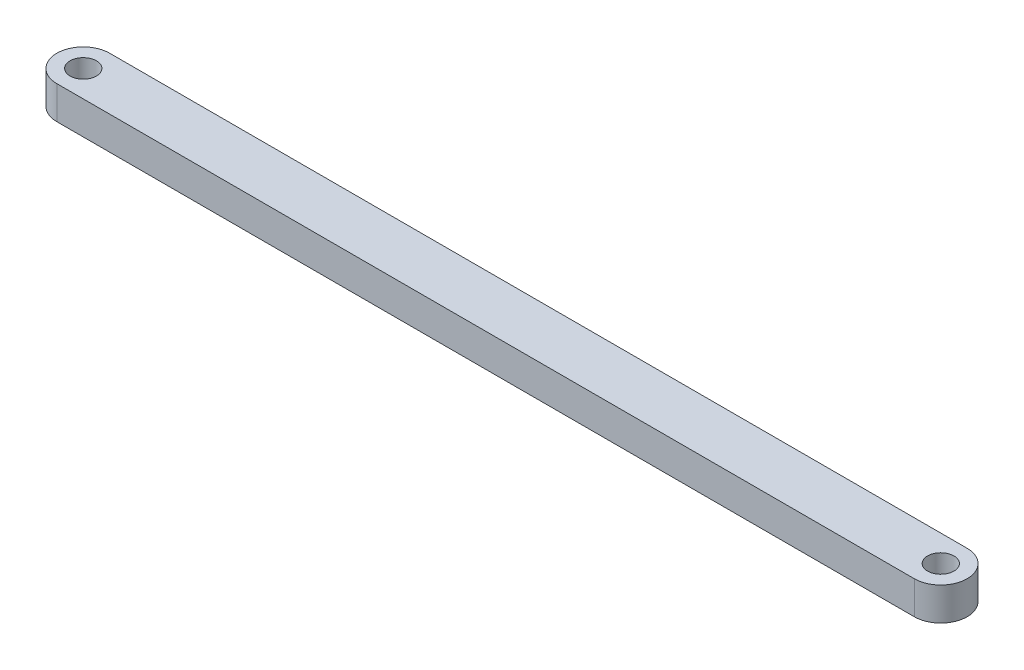
ISO-10303-21;
HEADER;
FILE_DESCRIPTION(('STEP AP214'),'2;1');
FILE_NAME('part.step','',(''),(''),'','','');
FILE_SCHEMA(('AUTOMOTIVE_DESIGN { 1 0 10303 214 1 1 1 1 }'));
ENDSEC;
DATA;
#1=APPLICATION_CONTEXT('core data for automotive mechanical design processes');
#2=APPLICATION_PROTOCOL_DEFINITION('international standard','automotive_design',2000,#1);
#3=PRODUCT_CONTEXT('',#1,'mechanical');
#4=PRODUCT('Part','Part','',(#3));
#5=PRODUCT_RELATED_PRODUCT_CATEGORY('part','',(#4));
#6=PRODUCT_DEFINITION_FORMATION('','',#4);
#7=PRODUCT_DEFINITION_CONTEXT('part definition',#1,'design');
#8=PRODUCT_DEFINITION('design','',#6,#7);
#9=PRODUCT_DEFINITION_SHAPE('','',#8);
#10=(LENGTH_UNIT() NAMED_UNIT(*) SI_UNIT(.MILLI.,.METRE.));
#11=(NAMED_UNIT(*) PLANE_ANGLE_UNIT() SI_UNIT($,.RADIAN.));
#12=(NAMED_UNIT(*) SI_UNIT($,.STERADIAN.) SOLID_ANGLE_UNIT());
#13=UNCERTAINTY_MEASURE_WITH_UNIT(LENGTH_MEASURE(1.E-05),#10,'distance_accuracy_value','');
#14=(GEOMETRIC_REPRESENTATION_CONTEXT(3) GLOBAL_UNCERTAINTY_ASSIGNED_CONTEXT((#13)) GLOBAL_UNIT_ASSIGNED_CONTEXT((#10,
#11,#12)) REPRESENTATION_CONTEXT('',''));
#15=CARTESIAN_POINT('',(0.,0.,0.));
#16=DIRECTION('',(0.,0.,1.));
#17=DIRECTION('',(1.,0.,0.));
#18=AXIS2_PLACEMENT_3D('',#15,#16,#17);
#19=CARTESIAN_POINT('',(-130.,10.,8.));
#20=DIRECTION('',(0.,1.,0.));
#21=DIRECTION('',(0.,0.,1.));
#22=AXIS2_PLACEMENT_3D('',#19,#20,#21);
#23=PLANE('',#22);
#24=CARTESIAN_POINT('',(-130.,10.,8.));
#25=DIRECTION('',(0.,1.,0.));
#26=DIRECTION('',(0.,0.,1.));
#27=AXIS2_PLACEMENT_3D('',#24,#25,#26);
#28=CIRCLE('',#27,3.99999999999999);
#29=CARTESIAN_POINT('',(-130.,10.,12.));
#30=VERTEX_POINT('',#29);
#31=EDGE_CURVE('E100',#30,#30,#28,.T.);
#32=ORIENTED_EDGE('',*,*,#31,.F.);
#33=EDGE_LOOP('',(#32));
#34=FACE_BOUND('',#33,.T.);
#35=CARTESIAN_POINT('',(-130.,10.,8.));
#36=DIRECTION('',(0.,1.,0.));
#37=DIRECTION('',(0.,0.,1.));
#38=AXIS2_PLACEMENT_3D('',#35,#36,#37);
#39=CIRCLE('',#38,8.);
#40=CARTESIAN_POINT('',(-130.,10.,0.));
#41=VERTEX_POINT('',#40);
#42=CARTESIAN_POINT('',(-130.,10.,16.));
#43=VERTEX_POINT('',#42);
#44=EDGE_CURVE('E85',#41,#43,#39,.T.);
#45=ORIENTED_EDGE('',*,*,#44,.T.);
#46=DIRECTION('',(1.,0.,0.));
#47=VECTOR('',#46,1.);
#48=CARTESIAN_POINT('',(-130.,10.,16.));
#49=LINE('',#48,#47);
#50=CARTESIAN_POINT('',(130.,10.,16.));
#51=VERTEX_POINT('',#50);
#52=EDGE_CURVE('E80',#43,#51,#49,.T.);
#53=ORIENTED_EDGE('',*,*,#52,.T.);
#54=CARTESIAN_POINT('',(130.,10.,8.));
#55=DIRECTION('',(0.,1.,0.));
#56=DIRECTION('',(0.,0.,-1.));
#57=AXIS2_PLACEMENT_3D('',#54,#55,#56);
#58=CIRCLE('',#57,8.);
#59=CARTESIAN_POINT('',(130.,10.,0.));
#60=VERTEX_POINT('',#59);
#61=EDGE_CURVE('E83',#51,#60,#58,.T.);
#62=ORIENTED_EDGE('',*,*,#61,.T.);
#63=DIRECTION('',(-1.,0.,0.));
#64=VECTOR('',#63,1.);
#65=CARTESIAN_POINT('',(-130.,10.,0.));
#66=LINE('',#65,#64);
#67=EDGE_CURVE('E50',#60,#41,#66,.T.);
#68=ORIENTED_EDGE('',*,*,#67,.T.);
#69=EDGE_LOOP('',(#45,#53,#62,#68));
#70=FACE_BOUND('',#69,.T.);
#71=CARTESIAN_POINT('',(130.,10.,8.));
#72=DIRECTION('',(0.,1.,0.));
#73=DIRECTION('',(0.,0.,1.));
#74=AXIS2_PLACEMENT_3D('',#71,#72,#73);
#75=CIRCLE('',#74,3.99999999999999);
#76=CARTESIAN_POINT('',(130.,10.,12.));
#77=VERTEX_POINT('',#76);
#78=EDGE_CURVE('E115',#77,#77,#75,.T.);
#79=ORIENTED_EDGE('',*,*,#78,.F.);
#80=EDGE_LOOP('',(#79));
#81=FACE_BOUND('',#80,.T.);
#82=ADVANCED_FACE('F33',(#34,#70,#81),#23,.T.);
#83=CARTESIAN_POINT('',(-130.,0.,8.));
#84=DIRECTION('',(0.,1.,0.));
#85=DIRECTION('',(0.,0.,1.));
#86=AXIS2_PLACEMENT_3D('',#83,#84,#85);
#87=PLANE('',#86);
#88=CARTESIAN_POINT('',(-130.,0.,8.));
#89=DIRECTION('',(0.,1.,0.));
#90=DIRECTION('',(0.,0.,1.));
#91=AXIS2_PLACEMENT_3D('',#88,#89,#90);
#92=CIRCLE('',#91,8.);
#93=CARTESIAN_POINT('',(-130.,0.,0.));
#94=VERTEX_POINT('',#93);
#95=CARTESIAN_POINT('',(-130.,0.,16.));
#96=VERTEX_POINT('',#95);
#97=EDGE_CURVE('E97',#94,#96,#92,.T.);
#98=ORIENTED_EDGE('',*,*,#97,.F.);
#99=DIRECTION('',(-1.,0.,0.));
#100=VECTOR('',#99,1.);
#101=CARTESIAN_POINT('',(-130.,0.,0.));
#102=LINE('',#101,#100);
#103=CARTESIAN_POINT('',(130.,0.,0.));
#104=VERTEX_POINT('',#103);
#105=EDGE_CURVE('E73',#104,#94,#102,.T.);
#106=ORIENTED_EDGE('',*,*,#105,.F.);
#107=CARTESIAN_POINT('',(130.,0.,8.));
#108=DIRECTION('',(0.,1.,0.));
#109=DIRECTION('',(0.,0.,-1.));
#110=AXIS2_PLACEMENT_3D('',#107,#108,#109);
#111=CIRCLE('',#110,8.);
#112=CARTESIAN_POINT('',(130.,0.,16.));
#113=VERTEX_POINT('',#112);
#114=EDGE_CURVE('E67',#113,#104,#111,.T.);
#115=ORIENTED_EDGE('',*,*,#114,.F.);
#116=DIRECTION('',(1.,0.,0.));
#117=VECTOR('',#116,1.);
#118=CARTESIAN_POINT('',(-130.,0.,16.));
#119=LINE('',#118,#117);
#120=EDGE_CURVE('E89',#96,#113,#119,.T.);
#121=ORIENTED_EDGE('',*,*,#120,.F.);
#122=EDGE_LOOP('',(#98,#106,#115,#121));
#123=FACE_BOUND('',#122,.T.);
#124=CARTESIAN_POINT('',(-130.,0.,8.));
#125=DIRECTION('',(0.,1.,0.));
#126=DIRECTION('',(0.,0.,1.));
#127=AXIS2_PLACEMENT_3D('',#124,#125,#126);
#128=CIRCLE('',#127,3.99999999999999);
#129=CARTESIAN_POINT('',(-130.,0.,12.));
#130=VERTEX_POINT('',#129);
#131=EDGE_CURVE('E112',#130,#130,#128,.T.);
#132=ORIENTED_EDGE('',*,*,#131,.T.);
#133=EDGE_LOOP('',(#132));
#134=FACE_BOUND('',#133,.T.);
#135=CARTESIAN_POINT('',(130.,0.,8.));
#136=DIRECTION('',(0.,1.,0.));
#137=DIRECTION('',(0.,0.,1.));
#138=AXIS2_PLACEMENT_3D('',#135,#136,#137);
#139=CIRCLE('',#138,3.99999999999999);
#140=CARTESIAN_POINT('',(130.,0.,12.));
#141=VERTEX_POINT('',#140);
#142=EDGE_CURVE('E118',#141,#141,#139,.T.);
#143=ORIENTED_EDGE('',*,*,#142,.T.);
#144=EDGE_LOOP('',(#143));
#145=FACE_BOUND('',#144,.T.);
#146=ADVANCED_FACE('F108',(#123,#134,#145),#87,.F.);
#147=CARTESIAN_POINT('',(-130.,10.,8.));
#148=DIRECTION('',(0.,-1.,0.));
#149=DIRECTION('',(0.,0.,-1.));
#150=AXIS2_PLACEMENT_3D('',#147,#148,#149);
#151=CYLINDRICAL_SURFACE('',#150,8.);
#152=ORIENTED_EDGE('',*,*,#97,.T.);
#153=DIRECTION('',(0.,-1.,0.));
#154=VECTOR('',#153,1.);
#155=CARTESIAN_POINT('',(-130.,10.,16.));
#156=LINE('',#155,#154);
#157=EDGE_CURVE('E11',#43,#96,#156,.T.);
#158=ORIENTED_EDGE('',*,*,#157,.F.);
#159=ORIENTED_EDGE('',*,*,#44,.F.);
#160=DIRECTION('',(0.,-1.,0.));
#161=VECTOR('',#160,1.);
#162=CARTESIAN_POINT('',(-130.,10.,0.));
#163=LINE('',#162,#161);
#164=EDGE_CURVE('E93',#41,#94,#163,.T.);
#165=ORIENTED_EDGE('',*,*,#164,.T.);
#166=EDGE_LOOP('',(#152,#158,#159,#165));
#167=FACE_BOUND('',#166,.T.);
#168=ADVANCED_FACE('F35',(#167),#151,.T.);
#169=CARTESIAN_POINT('',(-130.,10.,16.));
#170=DIRECTION('',(0.,0.,-1.));
#171=DIRECTION('',(-1.,0.,0.));
#172=AXIS2_PLACEMENT_3D('',#169,#170,#171);
#173=PLANE('',#172);
#174=ORIENTED_EDGE('',*,*,#120,.T.);
#175=DIRECTION('',(0.,-1.,0.));
#176=VECTOR('',#175,1.);
#177=CARTESIAN_POINT('',(130.,10.,16.));
#178=LINE('',#177,#176);
#179=EDGE_CURVE('E42',#51,#113,#178,.T.);
#180=ORIENTED_EDGE('',*,*,#179,.F.);
#181=ORIENTED_EDGE('',*,*,#52,.F.);
#182=ORIENTED_EDGE('',*,*,#157,.T.);
#183=EDGE_LOOP('',(#174,#180,#181,#182));
#184=FACE_BOUND('',#183,.T.);
#185=ADVANCED_FACE('F88',(#184),#173,.F.);
#186=CARTESIAN_POINT('',(130.,10.,8.));
#187=DIRECTION('',(0.,-1.,0.));
#188=DIRECTION('',(0.,0.,-1.));
#189=AXIS2_PLACEMENT_3D('',#186,#187,#188);
#190=CYLINDRICAL_SURFACE('',#189,8.);
#191=ORIENTED_EDGE('',*,*,#114,.T.);
#192=DIRECTION('',(0.,-1.,0.));
#193=VECTOR('',#192,1.);
#194=CARTESIAN_POINT('',(130.,10.,0.));
#195=LINE('',#194,#193);
#196=EDGE_CURVE('E90',#60,#104,#195,.T.);
#197=ORIENTED_EDGE('',*,*,#196,.F.);
#198=ORIENTED_EDGE('',*,*,#61,.F.);
#199=ORIENTED_EDGE('',*,*,#179,.T.);
#200=EDGE_LOOP('',(#191,#197,#198,#199));
#201=FACE_BOUND('',#200,.T.);
#202=ADVANCED_FACE('F91',(#201),#190,.T.);
#203=CARTESIAN_POINT('',(-130.,10.,0.));
#204=DIRECTION('',(0.,0.,1.));
#205=DIRECTION('',(1.,0.,0.));
#206=AXIS2_PLACEMENT_3D('',#203,#204,#205);
#207=PLANE('',#206);
#208=ORIENTED_EDGE('',*,*,#105,.T.);
#209=ORIENTED_EDGE('',*,*,#164,.F.);
#210=ORIENTED_EDGE('',*,*,#67,.F.);
#211=ORIENTED_EDGE('',*,*,#196,.T.);
#212=EDGE_LOOP('',(#208,#209,#210,#211));
#213=FACE_BOUND('',#212,.T.);
#214=ADVANCED_FACE('F105',(#213),#207,.F.);
#215=CARTESIAN_POINT('',(-130.,10.,8.));
#216=DIRECTION('',(0.,-1.,0.));
#217=DIRECTION('',(0.,0.,-1.));
#218=AXIS2_PLACEMENT_3D('',#215,#216,#217);
#219=CYLINDRICAL_SURFACE('',#218,3.99999999999999);
#220=ORIENTED_EDGE('',*,*,#31,.T.);
#221=EDGE_LOOP('',(#220));
#222=FACE_BOUND('',#221,.T.);
#223=ORIENTED_EDGE('',*,*,#131,.F.);
#224=EDGE_LOOP('',(#223));
#225=FACE_BOUND('',#224,.T.);
#226=ADVANCED_FACE('F135',(#222,#225),#219,.F.);
#227=CARTESIAN_POINT('',(130.,10.,8.));
#228=DIRECTION('',(0.,-1.,0.));
#229=DIRECTION('',(0.,0.,-1.));
#230=AXIS2_PLACEMENT_3D('',#227,#228,#229);
#231=CYLINDRICAL_SURFACE('',#230,3.99999999999999);
#232=ORIENTED_EDGE('',*,*,#78,.T.);
#233=EDGE_LOOP('',(#232));
#234=FACE_BOUND('',#233,.T.);
#235=ORIENTED_EDGE('',*,*,#142,.F.);
#236=EDGE_LOOP('',(#235));
#237=FACE_BOUND('',#236,.T.);
#238=ADVANCED_FACE('F124',(#234,#237),#231,.F.);
#239=CLOSED_SHELL('',(#82,#146,#168,#185,#202,#214,#226,#238));
#240=MANIFOLD_SOLID_BREP('B2',#239);
#241=ADVANCED_BREP_SHAPE_REPRESENTATION('',(#18,#240),#14);
#242=SHAPE_DEFINITION_REPRESENTATION(#9,#241);
ENDSEC;
END-ISO-10303-21;
